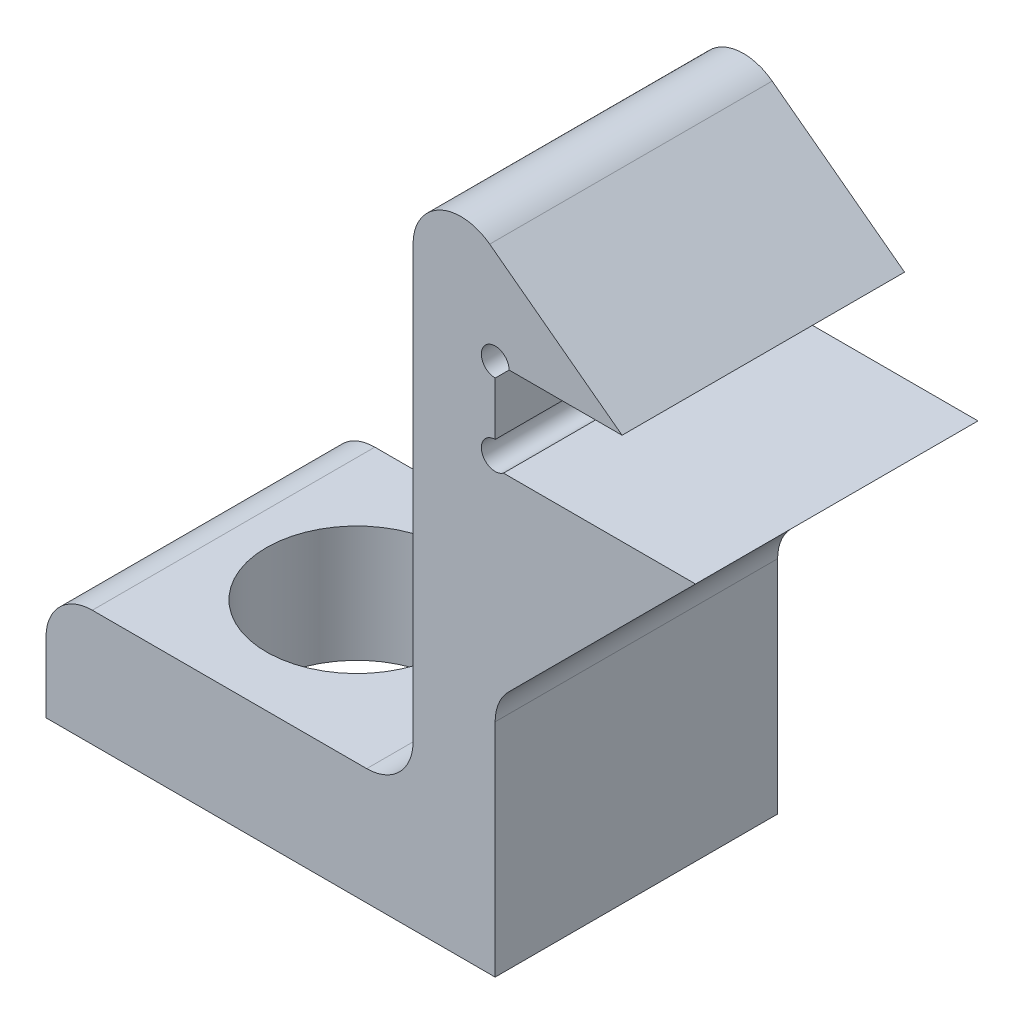
ISO-10303-21;
HEADER;
FILE_DESCRIPTION(('STEP AP214'),'2;1');
FILE_NAME('part.step','',(''),(''),'','','');
FILE_SCHEMA(('AUTOMOTIVE_DESIGN { 1 0 10303 214 1 1 1 1 }'));
ENDSEC;
DATA;
#1=APPLICATION_CONTEXT('core data for automotive mechanical design processes');
#2=APPLICATION_PROTOCOL_DEFINITION('international standard','automotive_design',2000,#1);
#3=PRODUCT_CONTEXT('',#1,'mechanical');
#4=PRODUCT('Part','Part','',(#3));
#5=PRODUCT_RELATED_PRODUCT_CATEGORY('part','',(#4));
#6=PRODUCT_DEFINITION_FORMATION('','',#4);
#7=PRODUCT_DEFINITION_CONTEXT('part definition',#1,'design');
#8=PRODUCT_DEFINITION('design','',#6,#7);
#9=PRODUCT_DEFINITION_SHAPE('','',#8);
#10=(LENGTH_UNIT() NAMED_UNIT(*) SI_UNIT(.MILLI.,.METRE.));
#11=(NAMED_UNIT(*) PLANE_ANGLE_UNIT() SI_UNIT($,.RADIAN.));
#12=(NAMED_UNIT(*) SI_UNIT($,.STERADIAN.) SOLID_ANGLE_UNIT());
#13=UNCERTAINTY_MEASURE_WITH_UNIT(LENGTH_MEASURE(1.E-05),#10,'distance_accuracy_value','');
#14=(GEOMETRIC_REPRESENTATION_CONTEXT(3) GLOBAL_UNCERTAINTY_ASSIGNED_CONTEXT((#13)) GLOBAL_UNIT_ASSIGNED_CONTEXT((#10,
#11,#12)) REPRESENTATION_CONTEXT('',''));
#15=CARTESIAN_POINT('',(0.,0.,0.));
#16=DIRECTION('',(0.,0.,1.));
#17=DIRECTION('',(1.,0.,0.));
#18=AXIS2_PLACEMENT_3D('',#15,#16,#17);
#19=CARTESIAN_POINT('',(-0.60512237933704,10.5097374090709,2.5));
#20=DIRECTION('',(0.,0.,-1.));
#21=DIRECTION('',(-1.,0.,0.));
#22=AXIS2_PLACEMENT_3D('',#19,#20,#21);
#23=CYLINDRICAL_SURFACE('',#22,0.847920800965803);
#24=CARTESIAN_POINT('',(-0.60512237933704,10.5097374090709,-2.5));
#25=DIRECTION('',(0.,0.,1.));
#26=DIRECTION('',(-1.,0.,0.));
#27=AXIS2_PLACEMENT_3D('',#24,#25,#26);
#28=CIRCLE('',#27,0.847920800965803);
#29=CARTESIAN_POINT('',(-0.0962536265630029,11.1879868301254,-2.5));
#30=VERTEX_POINT('',#29);
#31=CARTESIAN_POINT('',(-1.45304318030284,10.5097374090709,-2.5));
#32=VERTEX_POINT('',#31);
#33=EDGE_CURVE('E178',#30,#32,#28,.T.);
#34=ORIENTED_EDGE('',*,*,#33,.T.);
#35=DIRECTION('',(0.,0.,-1.));
#36=VECTOR('',#35,1.);
#37=CARTESIAN_POINT('',(-1.45304318030284,10.5097374090709,2.5));
#38=LINE('',#37,#36);
#39=CARTESIAN_POINT('',(-1.45304318030284,10.5097374090709,2.5));
#40=VERTEX_POINT('',#39);
#41=EDGE_CURVE('E11',#40,#32,#38,.T.);
#42=ORIENTED_EDGE('',*,*,#41,.F.);
#43=CARTESIAN_POINT('',(-0.60512237933704,10.5097374090709,2.5));
#44=DIRECTION('',(0.,0.,1.));
#45=DIRECTION('',(-1.,0.,0.));
#46=AXIS2_PLACEMENT_3D('',#43,#44,#45);
#47=CIRCLE('',#46,0.847920800965803);
#48=CARTESIAN_POINT('',(-0.0962536265630029,11.1879868301254,2.5));
#49=VERTEX_POINT('',#48);
#50=EDGE_CURVE('E209',#49,#40,#47,.T.);
#51=ORIENTED_EDGE('',*,*,#50,.F.);
#52=DIRECTION('',(0.,0.,-1.));
#53=VECTOR('',#52,1.);
#54=CARTESIAN_POINT('',(-0.0962536265630029,11.1879868301254,2.5));
#55=LINE('',#54,#53);
#56=EDGE_CURVE('E174',#49,#30,#55,.T.);
#57=ORIENTED_EDGE('',*,*,#56,.T.);
#58=EDGE_LOOP('',(#34,#42,#51,#57));
#59=FACE_BOUND('',#58,.T.);
#60=ADVANCED_FACE('F34',(#59),#23,.T.);
#61=CARTESIAN_POINT('',(-1.45304318030284,2.87964501484042,2.5));
#62=DIRECTION('',(1.,0.,0.));
#63=DIRECTION('',(0.,1.,0.));
#64=AXIS2_PLACEMENT_3D('',#61,#62,#63);
#65=PLANE('',#64);
#66=DIRECTION('',(0.,-1.,0.));
#67=VECTOR('',#66,1.);
#68=CARTESIAN_POINT('',(-1.45304318030284,2.87964501484042,-2.5));
#69=LINE('',#68,#67);
#70=CARTESIAN_POINT('',(-1.45304318030284,2.87964501484042,-2.5));
#71=VERTEX_POINT('',#70);
#72=EDGE_CURVE('E181',#32,#71,#69,.T.);
#73=ORIENTED_EDGE('',*,*,#72,.T.);
#74=DIRECTION('',(0.,0.,-1.));
#75=VECTOR('',#74,1.);
#76=CARTESIAN_POINT('',(-1.45304318030284,2.87964501484042,2.5));
#77=LINE('',#76,#75);
#78=CARTESIAN_POINT('',(-1.45304318030284,2.87964501484042,2.5));
#79=VERTEX_POINT('',#78);
#80=EDGE_CURVE('E42',#79,#71,#77,.T.);
#81=ORIENTED_EDGE('',*,*,#80,.F.);
#82=DIRECTION('',(0.,-1.,0.));
#83=VECTOR('',#82,1.);
#84=CARTESIAN_POINT('',(-1.45304318030284,2.87964501484042,2.5));
#85=LINE('',#84,#83);
#86=EDGE_CURVE('E117',#40,#79,#85,.T.);
#87=ORIENTED_EDGE('',*,*,#86,.F.);
#88=ORIENTED_EDGE('',*,*,#41,.T.);
#89=EDGE_LOOP('',(#73,#81,#87,#88));
#90=FACE_BOUND('',#89,.T.);
#91=ADVANCED_FACE('F307',(#90),#65,.F.);
#92=CARTESIAN_POINT('',(-2.27304318030284,2.87964501484042,2.5));
#93=DIRECTION('',(0.,0.,-1.));
#94=DIRECTION('',(-1.,0.,0.));
#95=AXIS2_PLACEMENT_3D('',#92,#93,#94);
#96=CYLINDRICAL_SURFACE('',#95,0.82);
#97=CARTESIAN_POINT('',(-2.27304318030284,2.87964501484042,-2.5));
#98=DIRECTION('',(0.,0.,-1.));
#99=DIRECTION('',(-1.,0.,0.));
#100=AXIS2_PLACEMENT_3D('',#97,#98,#99);
#101=CIRCLE('',#100,0.82);
#102=CARTESIAN_POINT('',(-2.27304318030284,2.05964501484042,-2.5));
#103=VERTEX_POINT('',#102);
#104=EDGE_CURVE('E184',#71,#103,#101,.T.);
#105=ORIENTED_EDGE('',*,*,#104,.T.);
#106=DIRECTION('',(0.,0.,-1.));
#107=VECTOR('',#106,1.);
#108=CARTESIAN_POINT('',(-2.27304318030284,2.05964501484042,2.5));
#109=LINE('',#108,#107);
#110=CARTESIAN_POINT('',(-2.27304318030284,2.05964501484042,2.5));
#111=VERTEX_POINT('',#110);
#112=EDGE_CURVE('E240',#111,#103,#109,.T.);
#113=ORIENTED_EDGE('',*,*,#112,.F.);
#114=CARTESIAN_POINT('',(-2.27304318030284,2.87964501484042,2.5));
#115=DIRECTION('',(0.,0.,-1.));
#116=DIRECTION('',(-1.,0.,0.));
#117=AXIS2_PLACEMENT_3D('',#114,#115,#116);
#118=CIRCLE('',#117,0.82);
#119=EDGE_CURVE('E248',#79,#111,#118,.T.);
#120=ORIENTED_EDGE('',*,*,#119,.F.);
#121=ORIENTED_EDGE('',*,*,#80,.T.);
#122=EDGE_LOOP('',(#105,#113,#120,#121));
#123=FACE_BOUND('',#122,.T.);
#124=ADVANCED_FACE('F246',(#123),#96,.F.);
#125=CARTESIAN_POINT('',(-2.27304318030284,2.05964501484042,2.5));
#126=DIRECTION('',(0.,-1.,0.));
#127=DIRECTION('',(1.,0.,0.));
#128=AXIS2_PLACEMENT_3D('',#125,#126,#127);
#129=PLANE('',#128);
#130=CARTESIAN_POINT('',(-4.95,2.05964501484042,0.));
#131=DIRECTION('',(0.,1.,0.));
#132=DIRECTION('',(-1.,0.,0.));
#133=AXIS2_PLACEMENT_3D('',#130,#131,#132);
#134=CIRCLE('',#133,1.6);
#135=CARTESIAN_POINT('',(-6.55,2.05964501484042,0.));
#136=VERTEX_POINT('',#135);
#137=EDGE_CURVE('E487',#136,#136,#134,.T.);
#138=ORIENTED_EDGE('',*,*,#137,.F.);
#139=EDGE_LOOP('',(#138));
#140=FACE_BOUND('',#139,.T.);
#141=DIRECTION('',(-1.,0.,0.));
#142=VECTOR('',#141,1.);
#143=CARTESIAN_POINT('',(-2.27304318030284,2.05964501484042,-2.5));
#144=LINE('',#143,#142);
#145=CARTESIAN_POINT('',(-7.13,2.05964501484042,-2.5));
#146=VERTEX_POINT('',#145);
#147=EDGE_CURVE('E186',#103,#146,#144,.T.);
#148=ORIENTED_EDGE('',*,*,#147,.T.);
#149=DIRECTION('',(0.,0.,-1.));
#150=VECTOR('',#149,1.);
#151=CARTESIAN_POINT('',(-7.13,2.05964501484042,2.5));
#152=LINE('',#151,#150);
#153=CARTESIAN_POINT('',(-7.13,2.05964501484042,2.5));
#154=VERTEX_POINT('',#153);
#155=EDGE_CURVE('E237',#154,#146,#152,.T.);
#156=ORIENTED_EDGE('',*,*,#155,.F.);
#157=DIRECTION('',(-1.,0.,0.));
#158=VECTOR('',#157,1.);
#159=CARTESIAN_POINT('',(-2.27304318030284,2.05964501484042,2.5));
#160=LINE('',#159,#158);
#161=EDGE_CURVE('E266',#111,#154,#160,.T.);
#162=ORIENTED_EDGE('',*,*,#161,.F.);
#163=ORIENTED_EDGE('',*,*,#112,.T.);
#164=EDGE_LOOP('',(#148,#156,#162,#163));
#165=FACE_BOUND('',#164,.T.);
#166=ADVANCED_FACE('F257',(#140,#165),#129,.F.);
#167=CARTESIAN_POINT('',(-7.13,1.23964501484042,2.5));
#168=DIRECTION('',(0.,0.,-1.));
#169=DIRECTION('',(-1.,0.,0.));
#170=AXIS2_PLACEMENT_3D('',#167,#168,#169);
#171=CYLINDRICAL_SURFACE('',#170,0.82);
#172=CARTESIAN_POINT('',(-7.13,1.23964501484042,-2.5));
#173=DIRECTION('',(0.,0.,1.));
#174=DIRECTION('',(-1.,0.,0.));
#175=AXIS2_PLACEMENT_3D('',#172,#173,#174);
#176=CIRCLE('',#175,0.82);
#177=CARTESIAN_POINT('',(-7.95,1.23964501484042,-2.5));
#178=VERTEX_POINT('',#177);
#179=EDGE_CURVE('E188',#146,#178,#176,.T.);
#180=ORIENTED_EDGE('',*,*,#179,.T.);
#181=DIRECTION('',(0.,0.,-1.));
#182=VECTOR('',#181,1.);
#183=CARTESIAN_POINT('',(-7.95,1.23964501484042,2.5));
#184=LINE('',#183,#182);
#185=CARTESIAN_POINT('',(-7.95,1.23964501484042,2.5));
#186=VERTEX_POINT('',#185);
#187=EDGE_CURVE('E234',#186,#178,#184,.T.);
#188=ORIENTED_EDGE('',*,*,#187,.F.);
#189=CARTESIAN_POINT('',(-7.13,1.23964501484042,2.5));
#190=DIRECTION('',(0.,0.,1.));
#191=DIRECTION('',(-1.,0.,0.));
#192=AXIS2_PLACEMENT_3D('',#189,#190,#191);
#193=CIRCLE('',#192,0.82);
#194=EDGE_CURVE('E263',#154,#186,#193,.T.);
#195=ORIENTED_EDGE('',*,*,#194,.F.);
#196=ORIENTED_EDGE('',*,*,#155,.T.);
#197=EDGE_LOOP('',(#180,#188,#195,#196));
#198=FACE_BOUND('',#197,.T.);
#199=ADVANCED_FACE('F261',(#198),#171,.T.);
#200=CARTESIAN_POINT('',(-7.95,1.23964501484042,2.5));
#201=DIRECTION('',(1.,0.,0.));
#202=DIRECTION('',(0.,0.,-1.));
#203=AXIS2_PLACEMENT_3D('',#200,#201,#202);
#204=PLANE('',#203);
#205=DIRECTION('',(0.,-1.,0.));
#206=VECTOR('',#205,1.);
#207=CARTESIAN_POINT('',(-7.95,1.23964501484042,-2.5));
#208=LINE('',#207,#206);
#209=CARTESIAN_POINT('',(-7.95,0.,-2.5));
#210=VERTEX_POINT('',#209);
#211=EDGE_CURVE('E190',#178,#210,#208,.T.);
#212=ORIENTED_EDGE('',*,*,#211,.T.);
#213=DIRECTION('',(0.,0.,-1.));
#214=VECTOR('',#213,1.);
#215=CARTESIAN_POINT('',(-7.95,0.,2.5));
#216=LINE('',#215,#214);
#217=CARTESIAN_POINT('',(-7.95,0.,2.5));
#218=VERTEX_POINT('',#217);
#219=EDGE_CURVE('E231',#218,#210,#216,.T.);
#220=ORIENTED_EDGE('',*,*,#219,.F.);
#221=DIRECTION('',(0.,-1.,0.));
#222=VECTOR('',#221,1.);
#223=CARTESIAN_POINT('',(-7.95,1.23964501484042,2.5));
#224=LINE('',#223,#222);
#225=EDGE_CURVE('E265',#186,#218,#224,.T.);
#226=ORIENTED_EDGE('',*,*,#225,.F.);
#227=ORIENTED_EDGE('',*,*,#187,.T.);
#228=EDGE_LOOP('',(#212,#220,#226,#227));
#229=FACE_BOUND('',#228,.T.);
#230=ADVANCED_FACE('F321',(#229),#204,.F.);
#231=CARTESIAN_POINT('',(-7.95,0.,2.5));
#232=DIRECTION('',(0.,1.,0.));
#233=DIRECTION('',(0.,0.,1.));
#234=AXIS2_PLACEMENT_3D('',#231,#232,#233);
#235=PLANE('',#234);
#236=CARTESIAN_POINT('',(-4.95,0.,0.));
#237=DIRECTION('',(0.,1.,0.));
#238=DIRECTION('',(-1.,0.,0.));
#239=AXIS2_PLACEMENT_3D('',#236,#237,#238);
#240=CIRCLE('',#239,1.6);
#241=CARTESIAN_POINT('',(-6.55,0.,0.));
#242=VERTEX_POINT('',#241);
#243=EDGE_CURVE('E182',#242,#242,#240,.T.);
#244=ORIENTED_EDGE('',*,*,#243,.T.);
#245=EDGE_LOOP('',(#244));
#246=FACE_BOUND('',#245,.T.);
#247=DIRECTION('',(1.,0.,0.));
#248=VECTOR('',#247,1.);
#249=CARTESIAN_POINT('',(-7.95,0.,-2.5));
#250=LINE('',#249,#248);
#251=CARTESIAN_POINT('',(0.,0.,-2.5));
#252=VERTEX_POINT('',#251);
#253=EDGE_CURVE('E192',#210,#252,#250,.T.);
#254=ORIENTED_EDGE('',*,*,#253,.T.);
#255=DIRECTION('',(0.,0.,-1.));
#256=VECTOR('',#255,1.);
#257=CARTESIAN_POINT('',(0.,0.,2.5));
#258=LINE('',#257,#256);
#259=CARTESIAN_POINT('',(0.,0.,2.5));
#260=VERTEX_POINT('',#259);
#261=EDGE_CURVE('E228',#260,#252,#258,.T.);
#262=ORIENTED_EDGE('',*,*,#261,.F.);
#263=DIRECTION('',(1.,0.,0.));
#264=VECTOR('',#263,1.);
#265=CARTESIAN_POINT('',(-7.95,0.,2.5));
#266=LINE('',#265,#264);
#267=EDGE_CURVE('E268',#218,#260,#266,.T.);
#268=ORIENTED_EDGE('',*,*,#267,.F.);
#269=ORIENTED_EDGE('',*,*,#219,.T.);
#270=EDGE_LOOP('',(#254,#262,#268,#269));
#271=FACE_BOUND('',#270,.T.);
#272=ADVANCED_FACE('F324',(#246,#271),#235,.F.);
#273=CARTESIAN_POINT('',(0.,3.91391643296943,2.5));
#274=DIRECTION('',(-1.,0.,0.));
#275=DIRECTION('',(0.,-1.,0.));
#276=AXIS2_PLACEMENT_3D('',#273,#274,#275);
#277=PLANE('',#276);
#278=DIRECTION('',(0.,1.,0.));
#279=VECTOR('',#278,1.);
#280=CARTESIAN_POINT('',(0.,3.91391643296943,-2.5));
#281=LINE('',#280,#279);
#282=CARTESIAN_POINT('',(0.,3.91391643296943,-2.5));
#283=VERTEX_POINT('',#282);
#284=EDGE_CURVE('E194',#252,#283,#281,.T.);
#285=ORIENTED_EDGE('',*,*,#284,.T.);
#286=DIRECTION('',(0.,0.,-1.));
#287=VECTOR('',#286,1.);
#288=CARTESIAN_POINT('',(0.,3.91391643296943,2.5));
#289=LINE('',#288,#287);
#290=CARTESIAN_POINT('',(0.,3.91391643296943,2.5));
#291=VERTEX_POINT('',#290);
#292=EDGE_CURVE('E225',#291,#283,#289,.T.);
#293=ORIENTED_EDGE('',*,*,#292,.F.);
#294=DIRECTION('',(0.,1.,0.));
#295=VECTOR('',#294,1.);
#296=CARTESIAN_POINT('',(0.,3.91391643296943,2.5));
#297=LINE('',#296,#295);
#298=EDGE_CURVE('E274',#260,#291,#297,.T.);
#299=ORIENTED_EDGE('',*,*,#298,.F.);
#300=ORIENTED_EDGE('',*,*,#261,.T.);
#301=EDGE_LOOP('',(#285,#293,#299,#300));
#302=FACE_BOUND('',#301,.T.);
#303=ADVANCED_FACE('F328',(#302),#277,.F.);
#304=CARTESIAN_POINT('',(0.818725507865946,3.91391643296943,2.5));
#305=DIRECTION('',(0.,0.,-1.));
#306=DIRECTION('',(-1.,0.,0.));
#307=AXIS2_PLACEMENT_3D('',#304,#305,#306);
#308=CYLINDRICAL_SURFACE('',#307,0.818725507865946);
#309=CARTESIAN_POINT('',(0.818725507865946,3.91391643296943,-2.5));
#310=DIRECTION('',(0.,0.,-1.));
#311=DIRECTION('',(1.,0.,0.));
#312=AXIS2_PLACEMENT_3D('',#309,#310,#311);
#313=CIRCLE('',#312,0.818725507865946);
#314=CARTESIAN_POINT('',(0.239799189750652,4.49284283193896,-2.5));
#315=VERTEX_POINT('',#314);
#316=EDGE_CURVE('E196',#283,#315,#313,.T.);
#317=ORIENTED_EDGE('',*,*,#316,.T.);
#318=DIRECTION('',(0.,0.,-1.));
#319=VECTOR('',#318,1.);
#320=CARTESIAN_POINT('',(0.239799189750652,4.49284283193896,2.5));
#321=LINE('',#320,#319);
#322=CARTESIAN_POINT('',(0.239799189750652,4.49284283193896,2.5));
#323=VERTEX_POINT('',#322);
#324=EDGE_CURVE('E222',#323,#315,#321,.T.);
#325=ORIENTED_EDGE('',*,*,#324,.F.);
#326=CARTESIAN_POINT('',(0.818725507865946,3.91391643296943,2.5));
#327=DIRECTION('',(0.,0.,-1.));
#328=DIRECTION('',(1.,0.,0.));
#329=AXIS2_PLACEMENT_3D('',#326,#327,#328);
#330=CIRCLE('',#329,0.818725507865946);
#331=EDGE_CURVE('E276',#291,#323,#330,.T.);
#332=ORIENTED_EDGE('',*,*,#331,.F.);
#333=ORIENTED_EDGE('',*,*,#292,.T.);
#334=EDGE_LOOP('',(#317,#325,#332,#333));
#335=FACE_BOUND('',#334,.T.);
#336=ADVANCED_FACE('F332',(#335),#308,.F.);
#337=CARTESIAN_POINT('',(3.54695681969716,7.8,2.5));
#338=DIRECTION('',(-0.707106731808439,0.707106830564653,0.));
#339=DIRECTION('',(-0.707106830564653,-0.707106731808439,0.));
#340=AXIS2_PLACEMENT_3D('',#337,#338,#339);
#341=PLANE('',#340);
#342=DIRECTION('',(0.707106830564653,0.707106731808439,0.));
#343=VECTOR('',#342,1.);
#344=CARTESIAN_POINT('',(3.54695681969716,7.8,-2.5));
#345=LINE('',#344,#343);
#346=CARTESIAN_POINT('',(3.54695681969716,7.8,-2.5));
#347=VERTEX_POINT('',#346);
#348=EDGE_CURVE('E198',#315,#347,#345,.T.);
#349=ORIENTED_EDGE('',*,*,#348,.T.);
#350=DIRECTION('',(0.,0.,-1.));
#351=VECTOR('',#350,1.);
#352=CARTESIAN_POINT('',(3.54695681969716,7.8,2.5));
#353=LINE('',#352,#351);
#354=CARTESIAN_POINT('',(3.54695681969716,7.8,2.5));
#355=VERTEX_POINT('',#354);
#356=EDGE_CURVE('E219',#355,#347,#353,.T.);
#357=ORIENTED_EDGE('',*,*,#356,.F.);
#358=DIRECTION('',(0.707106830564653,0.707106731808439,0.));
#359=VECTOR('',#358,1.);
#360=CARTESIAN_POINT('',(3.54695681969716,7.8,2.5));
#361=LINE('',#360,#359);
#362=EDGE_CURVE('E278',#323,#355,#361,.T.);
#363=ORIENTED_EDGE('',*,*,#362,.F.);
#364=ORIENTED_EDGE('',*,*,#324,.T.);
#365=EDGE_LOOP('',(#349,#357,#363,#364));
#366=FACE_BOUND('',#365,.T.);
#367=ADVANCED_FACE('F336',(#366),#341,.F.);
#368=CARTESIAN_POINT('',(0.147658859086547,7.8,2.5));
#369=DIRECTION('',(0.,-1.,0.));
#370=DIRECTION('',(1.,0.,0.));
#371=AXIS2_PLACEMENT_3D('',#368,#369,#370);
#372=PLANE('',#371);
#373=DIRECTION('',(-1.,0.,0.));
#374=VECTOR('',#373,1.);
#375=CARTESIAN_POINT('',(0.147658859086547,7.8,-2.5));
#376=LINE('',#375,#374);
#377=CARTESIAN_POINT('',(0.147658859086547,7.8,-2.5));
#378=VERTEX_POINT('',#377);
#379=EDGE_CURVE('E200',#347,#378,#376,.T.);
#380=ORIENTED_EDGE('',*,*,#379,.T.);
#381=DIRECTION('',(0.,0.,-1.));
#382=VECTOR('',#381,1.);
#383=CARTESIAN_POINT('',(0.147658859086547,7.8,2.5));
#384=LINE('',#383,#382);
#385=CARTESIAN_POINT('',(0.147658859086547,7.8,2.5));
#386=VERTEX_POINT('',#385);
#387=EDGE_CURVE('E216',#386,#378,#384,.T.);
#388=ORIENTED_EDGE('',*,*,#387,.F.);
#389=DIRECTION('',(-1.,0.,0.));
#390=VECTOR('',#389,1.);
#391=CARTESIAN_POINT('',(0.147658859086547,7.8,2.5));
#392=LINE('',#391,#390);
#393=EDGE_CURVE('E280',#355,#386,#392,.T.);
#394=ORIENTED_EDGE('',*,*,#393,.F.);
#395=ORIENTED_EDGE('',*,*,#356,.T.);
#396=EDGE_LOOP('',(#380,#388,#394,#395));
#397=FACE_BOUND('',#396,.T.);
#398=ADVANCED_FACE('F340',(#397),#372,.F.);
#399=CARTESIAN_POINT('',(0.0012740261226092,7.99722988731363,2.5));
#400=DIRECTION('',(0.,0.,-1.));
#401=DIRECTION('',(-1.,0.,0.));
#402=AXIS2_PLACEMENT_3D('',#399,#400,#401);
#403=CYLINDRICAL_SURFACE('',#402,0.245617889762992);
#404=CARTESIAN_POINT('',(0.0012740261226092,7.99722988731363,-2.5));
#405=DIRECTION('',(0.,0.,-1.));
#406=DIRECTION('',(1.,0.,0.));
#407=AXIS2_PLACEMENT_3D('',#404,#405,#406);
#408=CIRCLE('',#407,0.245617889762992);
#409=CARTESIAN_POINT('',(0.00127402612260916,8.24284777707662,-2.5));
#410=VERTEX_POINT('',#409);
#411=EDGE_CURVE('E202',#378,#410,#408,.T.);
#412=ORIENTED_EDGE('',*,*,#411,.T.);
#413=DIRECTION('',(0.,0.,-1.));
#414=VECTOR('',#413,1.);
#415=CARTESIAN_POINT('',(0.00127402612260916,8.24284777707662,2.5));
#416=LINE('',#415,#414);
#417=CARTESIAN_POINT('',(0.00127402612260916,8.24284777707662,2.5));
#418=VERTEX_POINT('',#417);
#419=EDGE_CURVE('E213',#418,#410,#416,.T.);
#420=ORIENTED_EDGE('',*,*,#419,.F.);
#421=CARTESIAN_POINT('',(0.0012740261226092,7.99722988731363,2.5));
#422=DIRECTION('',(0.,0.,-1.));
#423=DIRECTION('',(1.,0.,0.));
#424=AXIS2_PLACEMENT_3D('',#421,#422,#423);
#425=CIRCLE('',#424,0.245617889762992);
#426=EDGE_CURVE('E282',#386,#418,#425,.T.);
#427=ORIENTED_EDGE('',*,*,#426,.F.);
#428=ORIENTED_EDGE('',*,*,#387,.T.);
#429=EDGE_LOOP('',(#412,#420,#427,#428));
#430=FACE_BOUND('',#429,.T.);
#431=ADVANCED_FACE('F288',(#430),#403,.F.);
#432=CARTESIAN_POINT('',(0.00127402612260905,9.18438211023709,2.5));
#433=DIRECTION('',(-1.,0.,0.));
#434=DIRECTION('',(0.,-1.,0.));
#435=AXIS2_PLACEMENT_3D('',#432,#433,#434);
#436=PLANE('',#435);
#437=DIRECTION('',(0.,1.,0.));
#438=VECTOR('',#437,1.);
#439=CARTESIAN_POINT('',(0.00127402612260905,9.18438211023709,-2.5));
#440=LINE('',#439,#438);
#441=CARTESIAN_POINT('',(0.00127402612260905,9.18438211023709,-2.5));
#442=VERTEX_POINT('',#441);
#443=EDGE_CURVE('E204',#410,#442,#440,.T.);
#444=ORIENTED_EDGE('',*,*,#443,.T.);
#445=DIRECTION('',(0.,0.,-1.));
#446=VECTOR('',#445,1.);
#447=CARTESIAN_POINT('',(0.00127402612260905,9.18438211023709,2.5));
#448=LINE('',#447,#446);
#449=CARTESIAN_POINT('',(0.00127402612260905,9.18438211023709,2.5));
#450=VERTEX_POINT('',#449);
#451=EDGE_CURVE('E169',#450,#442,#448,.T.);
#452=ORIENTED_EDGE('',*,*,#451,.F.);
#453=DIRECTION('',(0.,1.,0.));
#454=VECTOR('',#453,1.);
#455=CARTESIAN_POINT('',(0.00127402612260905,9.18438211023709,2.5));
#456=LINE('',#455,#454);
#457=EDGE_CURVE('E160',#418,#450,#456,.T.);
#458=ORIENTED_EDGE('',*,*,#457,.F.);
#459=ORIENTED_EDGE('',*,*,#419,.T.);
#460=EDGE_LOOP('',(#444,#452,#458,#459));
#461=FACE_BOUND('',#460,.T.);
#462=ADVANCED_FACE('F292',(#461),#436,.F.);
#463=CARTESIAN_POINT('',(0.00127402612260902,9.43,2.5));
#464=DIRECTION('',(0.,0.,-1.));
#465=DIRECTION('',(-1.,0.,0.));
#466=AXIS2_PLACEMENT_3D('',#463,#464,#465);
#467=CYLINDRICAL_SURFACE('',#466,0.245617889762954);
#468=CARTESIAN_POINT('',(0.00127402612260902,9.43,-2.5));
#469=DIRECTION('',(0.,0.,-1.));
#470=DIRECTION('',(1.,0.,0.));
#471=AXIS2_PLACEMENT_3D('',#468,#469,#470);
#472=CIRCLE('',#471,0.245617889762954);
#473=CARTESIAN_POINT('',(0.246891915885563,9.43,-2.5));
#474=VERTEX_POINT('',#473);
#475=EDGE_CURVE('E168',#442,#474,#472,.T.);
#476=ORIENTED_EDGE('',*,*,#475,.T.);
#477=DIRECTION('',(0.,0.,-1.));
#478=VECTOR('',#477,1.);
#479=CARTESIAN_POINT('',(0.246891915885563,9.43,2.5));
#480=LINE('',#479,#478);
#481=CARTESIAN_POINT('',(0.246891915885563,9.43,2.5));
#482=VERTEX_POINT('',#481);
#483=EDGE_CURVE('E165',#482,#474,#480,.T.);
#484=ORIENTED_EDGE('',*,*,#483,.F.);
#485=CARTESIAN_POINT('',(0.00127402612260902,9.43,2.5));
#486=DIRECTION('',(0.,0.,-1.));
#487=DIRECTION('',(1.,0.,0.));
#488=AXIS2_PLACEMENT_3D('',#485,#486,#487);
#489=CIRCLE('',#488,0.245617889762954);
#490=EDGE_CURVE('E154',#450,#482,#489,.T.);
#491=ORIENTED_EDGE('',*,*,#490,.F.);
#492=ORIENTED_EDGE('',*,*,#451,.T.);
#493=EDGE_LOOP('',(#476,#484,#491,#492));
#494=FACE_BOUND('',#493,.T.);
#495=ADVANCED_FACE('F166',(#494),#467,.F.);
#496=CARTESIAN_POINT('',(2.2468919158856,9.43000000000001,2.5));
#497=DIRECTION('',(0.,1.,0.));
#498=DIRECTION('',(-1.,0.,0.));
#499=AXIS2_PLACEMENT_3D('',#496,#497,#498);
#500=PLANE('',#499);
#501=DIRECTION('',(1.,0.,0.));
#502=VECTOR('',#501,1.);
#503=CARTESIAN_POINT('',(2.2468919158856,9.43000000000001,-2.5));
#504=LINE('',#503,#502);
#505=CARTESIAN_POINT('',(2.2468919158856,9.43000000000001,-2.5));
#506=VERTEX_POINT('',#505);
#507=EDGE_CURVE('E103',#474,#506,#504,.T.);
#508=ORIENTED_EDGE('',*,*,#507,.T.);
#509=DIRECTION('',(0.,0.,-1.));
#510=VECTOR('',#509,1.);
#511=CARTESIAN_POINT('',(2.2468919158856,9.43000000000001,2.5));
#512=LINE('',#511,#510);
#513=CARTESIAN_POINT('',(2.2468919158856,9.43000000000001,2.5));
#514=VERTEX_POINT('',#513);
#515=EDGE_CURVE('E170',#514,#506,#512,.T.);
#516=ORIENTED_EDGE('',*,*,#515,.F.);
#517=DIRECTION('',(1.,0.,0.));
#518=VECTOR('',#517,1.);
#519=CARTESIAN_POINT('',(2.2468919158856,9.43000000000001,2.5));
#520=LINE('',#519,#518);
#521=EDGE_CURVE('E158',#482,#514,#520,.T.);
#522=ORIENTED_EDGE('',*,*,#521,.F.);
#523=ORIENTED_EDGE('',*,*,#483,.T.);
#524=EDGE_LOOP('',(#508,#516,#522,#523));
#525=FACE_BOUND('',#524,.T.);
#526=ADVANCED_FACE('F172',(#525),#500,.F.);
#527=CARTESIAN_POINT('',(-0.0962536265630029,11.1879868301254,2.5));
#528=DIRECTION('',(-0.600137126243893,-0.799897136951822,0.));
#529=DIRECTION('',(0.799897136951822,-0.600137126243893,0.));
#530=AXIS2_PLACEMENT_3D('',#527,#528,#529);
#531=PLANE('',#530);
#532=DIRECTION('',(-0.799897136951822,0.600137126243893,0.));
#533=VECTOR('',#532,1.);
#534=CARTESIAN_POINT('',(-0.0962536265630029,11.1879868301254,-2.5));
#535=LINE('',#534,#533);
#536=EDGE_CURVE('E109',#506,#30,#535,.T.);
#537=ORIENTED_EDGE('',*,*,#536,.T.);
#538=ORIENTED_EDGE('',*,*,#56,.F.);
#539=DIRECTION('',(-0.799897136951822,0.600137126243893,0.));
#540=VECTOR('',#539,1.);
#541=CARTESIAN_POINT('',(-0.0962536265630029,11.1879868301254,2.5));
#542=LINE('',#541,#540);
#543=EDGE_CURVE('E50',#514,#49,#542,.T.);
#544=ORIENTED_EDGE('',*,*,#543,.F.);
#545=ORIENTED_EDGE('',*,*,#515,.T.);
#546=EDGE_LOOP('',(#537,#538,#544,#545));
#547=FACE_BOUND('',#546,.T.);
#548=ADVANCED_FACE('F296',(#547),#531,.F.);
#549=CARTESIAN_POINT('',(-0.60512237933704,10.5097374090709,2.5));
#550=DIRECTION('',(0.,0.,-1.));
#551=DIRECTION('',(-1.,0.,0.));
#552=AXIS2_PLACEMENT_3D('',#549,#550,#551);
#553=PLANE('',#552);
#554=ORIENTED_EDGE('',*,*,#50,.T.);
#555=ORIENTED_EDGE('',*,*,#86,.T.);
#556=ORIENTED_EDGE('',*,*,#119,.T.);
#557=ORIENTED_EDGE('',*,*,#161,.T.);
#558=ORIENTED_EDGE('',*,*,#194,.T.);
#559=ORIENTED_EDGE('',*,*,#225,.T.);
#560=ORIENTED_EDGE('',*,*,#267,.T.);
#561=ORIENTED_EDGE('',*,*,#298,.T.);
#562=ORIENTED_EDGE('',*,*,#331,.T.);
#563=ORIENTED_EDGE('',*,*,#362,.T.);
#564=ORIENTED_EDGE('',*,*,#393,.T.);
#565=ORIENTED_EDGE('',*,*,#426,.T.);
#566=ORIENTED_EDGE('',*,*,#457,.T.);
#567=ORIENTED_EDGE('',*,*,#490,.T.);
#568=ORIENTED_EDGE('',*,*,#521,.T.);
#569=ORIENTED_EDGE('',*,*,#543,.T.);
#570=EDGE_LOOP('',(#554,#555,#556,#557,#558,#559,#560,#561,#562,#563,#564,#565,#566,#567,#568,#569));
#571=FACE_BOUND('',#570,.T.);
#572=ADVANCED_FACE('F156',(#571),#553,.F.);
#573=CARTESIAN_POINT('',(-0.60512237933704,10.5097374090709,-2.5));
#574=DIRECTION('',(0.,0.,-1.));
#575=DIRECTION('',(-1.,0.,0.));
#576=AXIS2_PLACEMENT_3D('',#573,#574,#575);
#577=PLANE('',#576);
#578=ORIENTED_EDGE('',*,*,#33,.F.);
#579=ORIENTED_EDGE('',*,*,#536,.F.);
#580=ORIENTED_EDGE('',*,*,#507,.F.);
#581=ORIENTED_EDGE('',*,*,#475,.F.);
#582=ORIENTED_EDGE('',*,*,#443,.F.);
#583=ORIENTED_EDGE('',*,*,#411,.F.);
#584=ORIENTED_EDGE('',*,*,#379,.F.);
#585=ORIENTED_EDGE('',*,*,#348,.F.);
#586=ORIENTED_EDGE('',*,*,#316,.F.);
#587=ORIENTED_EDGE('',*,*,#284,.F.);
#588=ORIENTED_EDGE('',*,*,#253,.F.);
#589=ORIENTED_EDGE('',*,*,#211,.F.);
#590=ORIENTED_EDGE('',*,*,#179,.F.);
#591=ORIENTED_EDGE('',*,*,#147,.F.);
#592=ORIENTED_EDGE('',*,*,#104,.F.);
#593=ORIENTED_EDGE('',*,*,#72,.F.);
#594=EDGE_LOOP('',(#578,#579,#580,#581,#582,#583,#584,#585,#586,#587,#588,#589,#590,#591,#592,#593));
#595=FACE_BOUND('',#594,.T.);
#596=ADVANCED_FACE('F252',(#595),#577,.T.);
#597=CARTESIAN_POINT('',(-4.95,0.,0.));
#598=DIRECTION('',(0.,1.,0.));
#599=DIRECTION('',(-1.,0.,0.));
#600=AXIS2_PLACEMENT_3D('',#597,#598,#599);
#601=CYLINDRICAL_SURFACE('',#600,1.6);
#602=ORIENTED_EDGE('',*,*,#243,.F.);
#603=EDGE_LOOP('',(#602));
#604=FACE_BOUND('',#603,.T.);
#605=ORIENTED_EDGE('',*,*,#137,.T.);
#606=EDGE_LOOP('',(#605));
#607=FACE_BOUND('',#606,.T.);
#608=ADVANCED_FACE('F372',(#604,#607),#601,.F.);
#609=CLOSED_SHELL('',(#60,#91,#124,#166,#199,#230,#272,#303,#336,#367,#398,#431,#462,#495,#526,
#548,#572,#596,#608));
#610=MANIFOLD_SOLID_BREP('B2',#609);
#611=ADVANCED_BREP_SHAPE_REPRESENTATION('',(#18,#610),#14);
#612=SHAPE_DEFINITION_REPRESENTATION(#9,#611);
ENDSEC;
END-ISO-10303-21;
